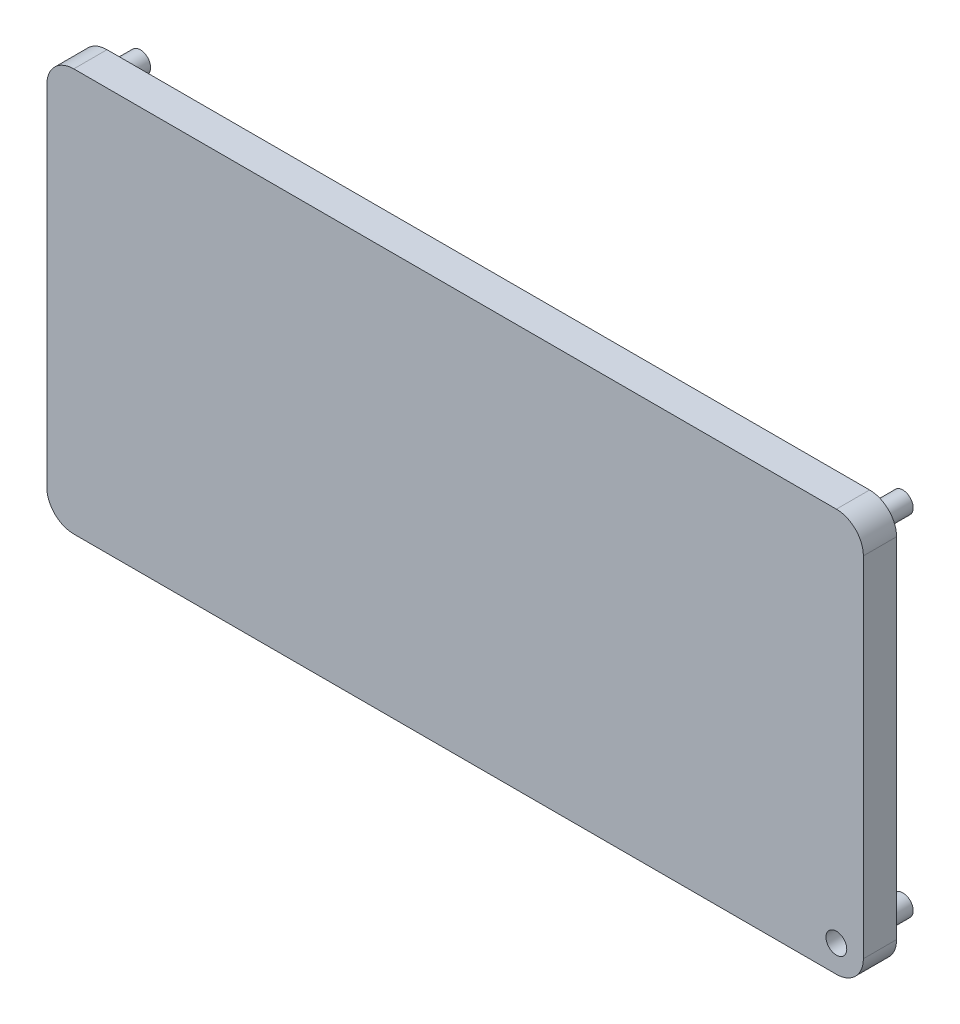
ISO-10303-21;
HEADER;
FILE_DESCRIPTION(('STEP AP214'),'2;1');
FILE_NAME('part.step','',(''),(''),'','','');
FILE_SCHEMA(('AUTOMOTIVE_DESIGN { 1 0 10303 214 1 1 1 1 }'));
ENDSEC;
DATA;
#1=APPLICATION_CONTEXT('core data for automotive mechanical design processes');
#2=APPLICATION_PROTOCOL_DEFINITION('international standard','automotive_design',2000,#1);
#3=PRODUCT_CONTEXT('',#1,'mechanical');
#4=PRODUCT('Part','Part','',(#3));
#5=PRODUCT_RELATED_PRODUCT_CATEGORY('part','',(#4));
#6=PRODUCT_DEFINITION_FORMATION('','',#4);
#7=PRODUCT_DEFINITION_CONTEXT('part definition',#1,'design');
#8=PRODUCT_DEFINITION('design','',#6,#7);
#9=PRODUCT_DEFINITION_SHAPE('','',#8);
#10=(LENGTH_UNIT() NAMED_UNIT(*) SI_UNIT(.MILLI.,.METRE.));
#11=(NAMED_UNIT(*) PLANE_ANGLE_UNIT() SI_UNIT($,.RADIAN.));
#12=(NAMED_UNIT(*) SI_UNIT($,.STERADIAN.) SOLID_ANGLE_UNIT());
#13=UNCERTAINTY_MEASURE_WITH_UNIT(LENGTH_MEASURE(1.E-05),#10,'distance_accuracy_value','');
#14=(GEOMETRIC_REPRESENTATION_CONTEXT(3) GLOBAL_UNCERTAINTY_ASSIGNED_CONTEXT((#13)) GLOBAL_UNIT_ASSIGNED_CONTEXT((#10,
#11,#12)) REPRESENTATION_CONTEXT('',''));
#15=CARTESIAN_POINT('',(0.,0.,0.));
#16=DIRECTION('',(0.,0.,1.));
#17=DIRECTION('',(1.,0.,0.));
#18=AXIS2_PLACEMENT_3D('',#15,#16,#17);
#19=CARTESIAN_POINT('',(58.297572,-26.67,5.08));
#20=DIRECTION('',(0.,0.,-1.));
#21=DIRECTION('',(-1.,0.,0.));
#22=AXIS2_PLACEMENT_3D('',#19,#20,#21);
#23=CYLINDRICAL_SURFACE('',#22,1.5875);
#24=CARTESIAN_POINT('',(58.297572,-26.67,5.08));
#25=DIRECTION('',(0.,0.,1.));
#26=DIRECTION('',(1.,0.,0.));
#27=AXIS2_PLACEMENT_3D('',#24,#25,#26);
#28=CIRCLE('',#27,1.5875);
#29=CARTESIAN_POINT('',(59.885072,-26.67,5.08));
#30=VERTEX_POINT('',#29);
#31=EDGE_CURVE('E12',#30,#30,#28,.T.);
#32=ORIENTED_EDGE('',*,*,#31,.F.);
#33=EDGE_LOOP('',(#32));
#34=FACE_BOUND('',#33,.T.);
#35=CARTESIAN_POINT('',(58.297572,-26.67,0.));
#36=DIRECTION('',(0.,0.,1.));
#37=DIRECTION('',(1.,0.,0.));
#38=AXIS2_PLACEMENT_3D('',#35,#36,#37);
#39=CIRCLE('',#38,1.5875);
#40=CARTESIAN_POINT('',(59.885072,-26.67,0.));
#41=VERTEX_POINT('',#40);
#42=EDGE_CURVE('E127',#41,#41,#39,.T.);
#43=ORIENTED_EDGE('',*,*,#42,.T.);
#44=EDGE_LOOP('',(#43));
#45=FACE_BOUND('',#44,.T.);
#46=ADVANCED_FACE('F124',(#34,#45),#23,.T.);
#47=CARTESIAN_POINT('',(0.,0.,5.08));
#48=DIRECTION('',(0.,0.,1.));
#49=DIRECTION('',(1.,0.,0.));
#50=AXIS2_PLACEMENT_3D('',#47,#48,#49);
#51=PLANE('',#50);
#52=ORIENTED_EDGE('',*,*,#31,.T.);
#53=EDGE_LOOP('',(#52));
#54=FACE_BOUND('',#53,.T.);
#55=ADVANCED_FACE('F139',(#54),#51,.T.);
#56=CARTESIAN_POINT('',(0.,0.,0.));
#57=DIRECTION('',(0.,0.,1.));
#58=DIRECTION('',(1.,0.,0.));
#59=AXIS2_PLACEMENT_3D('',#56,#57,#58);
#60=PLANE('',#59);
#61=ORIENTED_EDGE('',*,*,#42,.F.);
#62=EDGE_LOOP('',(#61));
#63=FACE_BOUND('',#62,.T.);
#64=ADVANCED_FACE('F137',(#63),#60,.F.);
#65=CLOSED_SHELL('',(#46,#55,#64));
#66=MANIFOLD_SOLID_BREP('B2',#65);
#67=CARTESIAN_POINT('',(-58.297572,-26.67,5.08));
#68=DIRECTION('',(0.,0.,-1.));
#69=DIRECTION('',(-1.,0.,0.));
#70=AXIS2_PLACEMENT_3D('',#67,#68,#69);
#71=CYLINDRICAL_SURFACE('',#70,1.5875);
#72=CARTESIAN_POINT('',(-58.297572,-26.67,5.08));
#73=DIRECTION('',(0.,0.,1.));
#74=DIRECTION('',(1.,0.,0.));
#75=AXIS2_PLACEMENT_3D('',#72,#73,#74);
#76=CIRCLE('',#75,1.5875);
#77=CARTESIAN_POINT('',(-56.710072,-26.67,5.08));
#78=VERTEX_POINT('',#77);
#79=EDGE_CURVE('E300',#78,#78,#76,.T.);
#80=ORIENTED_EDGE('',*,*,#79,.F.);
#81=EDGE_LOOP('',(#80));
#82=FACE_BOUND('',#81,.T.);
#83=CARTESIAN_POINT('',(-58.297572,-26.67,0.));
#84=DIRECTION('',(0.,0.,1.));
#85=DIRECTION('',(1.,0.,0.));
#86=AXIS2_PLACEMENT_3D('',#83,#84,#85);
#87=CIRCLE('',#86,1.5875);
#88=CARTESIAN_POINT('',(-56.710072,-26.67,0.));
#89=VERTEX_POINT('',#88);
#90=EDGE_CURVE('E299',#89,#89,#87,.T.);
#91=ORIENTED_EDGE('',*,*,#90,.T.);
#92=EDGE_LOOP('',(#91));
#93=FACE_BOUND('',#92,.T.);
#94=ADVANCED_FACE('F165',(#82,#93),#71,.T.);
#95=CARTESIAN_POINT('',(0.,0.,0.));
#96=DIRECTION('',(0.,0.,1.));
#97=DIRECTION('',(1.,0.,0.));
#98=AXIS2_PLACEMENT_3D('',#95,#96,#97);
#99=PLANE('',#98);
#100=ORIENTED_EDGE('',*,*,#90,.F.);
#101=EDGE_LOOP('',(#100));
#102=FACE_BOUND('',#101,.T.);
#103=ADVANCED_FACE('F325',(#102),#99,.F.);
#104=CARTESIAN_POINT('',(58.297572,-26.67,10.16));
#105=DIRECTION('',(0.,0.,-1.));
#106=DIRECTION('',(-1.,0.,0.));
#107=AXIS2_PLACEMENT_3D('',#104,#105,#106);
#108=CYLINDRICAL_SURFACE('',#107,1.5875);
#109=CARTESIAN_POINT('',(58.297572,-26.67,10.16));
#110=DIRECTION('',(0.,0.,1.));
#111=DIRECTION('',(1.,0.,0.));
#112=AXIS2_PLACEMENT_3D('',#109,#110,#111);
#113=CIRCLE('',#112,1.5875);
#114=CARTESIAN_POINT('',(59.885072,-26.67,10.16));
#115=VERTEX_POINT('',#114);
#116=EDGE_CURVE('E258',#115,#115,#113,.T.);
#117=ORIENTED_EDGE('',*,*,#116,.T.);
#118=EDGE_LOOP('',(#117));
#119=FACE_BOUND('',#118,.T.);
#120=CARTESIAN_POINT('',(58.297572,-26.67,5.08));
#121=DIRECTION('',(0.,0.,1.));
#122=DIRECTION('',(1.,0.,0.));
#123=AXIS2_PLACEMENT_3D('',#120,#121,#122);
#124=CIRCLE('',#123,1.5875);
#125=CARTESIAN_POINT('',(59.885072,-26.67,5.08));
#126=VERTEX_POINT('',#125);
#127=EDGE_CURVE('E285',#126,#126,#124,.T.);
#128=ORIENTED_EDGE('',*,*,#127,.F.);
#129=EDGE_LOOP('',(#128));
#130=FACE_BOUND('',#129,.T.);
#131=ADVANCED_FACE('F322',(#119,#130),#108,.F.);
#132=CARTESIAN_POINT('',(58.297572,-26.67,10.16));
#133=DIRECTION('',(0.,0.,-1.));
#134=DIRECTION('',(-1.,0.,0.));
#135=AXIS2_PLACEMENT_3D('',#132,#133,#134);
#136=CYLINDRICAL_SURFACE('',#135,4.1275);
#137=CARTESIAN_POINT('',(58.297572,-26.67,5.08));
#138=DIRECTION('',(0.,0.,1.));
#139=DIRECTION('',(1.,0.,0.));
#140=AXIS2_PLACEMENT_3D('',#137,#138,#139);
#141=CIRCLE('',#140,4.1275);
#142=CARTESIAN_POINT('',(58.297572,-30.7975,5.08));
#143=VERTEX_POINT('',#142);
#144=CARTESIAN_POINT('',(62.425072,-26.67,5.08));
#145=VERTEX_POINT('',#144);
#146=EDGE_CURVE('E267',#143,#145,#141,.T.);
#147=ORIENTED_EDGE('',*,*,#146,.T.);
#148=DIRECTION('',(0.,0.,-1.));
#149=VECTOR('',#148,1.);
#150=CARTESIAN_POINT('',(62.425072,-26.67,10.16));
#151=LINE('',#150,#149);
#152=CARTESIAN_POINT('',(62.425072,-26.67,10.16));
#153=VERTEX_POINT('',#152);
#154=EDGE_CURVE('E296',#153,#145,#151,.T.);
#155=ORIENTED_EDGE('',*,*,#154,.F.);
#156=CARTESIAN_POINT('',(58.297572,-26.67,10.16));
#157=DIRECTION('',(0.,0.,1.));
#158=DIRECTION('',(1.,0.,0.));
#159=AXIS2_PLACEMENT_3D('',#156,#157,#158);
#160=CIRCLE('',#159,4.1275);
#161=CARTESIAN_POINT('',(58.297572,-30.7975,10.16));
#162=VERTEX_POINT('',#161);
#163=EDGE_CURVE('E487',#162,#153,#160,.T.);
#164=ORIENTED_EDGE('',*,*,#163,.F.);
#165=DIRECTION('',(0.,0.,-1.));
#166=VECTOR('',#165,1.);
#167=CARTESIAN_POINT('',(58.297572,-30.7975,10.16));
#168=LINE('',#167,#166);
#169=EDGE_CURVE('E220',#162,#143,#168,.T.);
#170=ORIENTED_EDGE('',*,*,#169,.T.);
#171=EDGE_LOOP('',(#147,#155,#164,#170));
#172=FACE_BOUND('',#171,.T.);
#173=ADVANCED_FACE('F324',(#172),#136,.T.);
#174=CARTESIAN_POINT('',(62.425072,0.,10.16));
#175=DIRECTION('',(1.,0.,0.));
#176=DIRECTION('',(0.,0.,-1.));
#177=AXIS2_PLACEMENT_3D('',#174,#175,#176);
#178=PLANE('',#177);
#179=DIRECTION('',(0.,-1.,0.));
#180=VECTOR('',#179,1.);
#181=CARTESIAN_POINT('',(62.425072,0.,5.08));
#182=LINE('',#181,#180);
#183=CARTESIAN_POINT('',(62.425072,26.67,5.08));
#184=VERTEX_POINT('',#183);
#185=EDGE_CURVE('E271',#184,#145,#182,.T.);
#186=ORIENTED_EDGE('',*,*,#185,.F.);
#187=DIRECTION('',(0.,0.,-1.));
#188=VECTOR('',#187,1.);
#189=CARTESIAN_POINT('',(62.425072,26.67,10.16));
#190=LINE('',#189,#188);
#191=CARTESIAN_POINT('',(62.425072,26.67,10.16));
#192=VERTEX_POINT('',#191);
#193=EDGE_CURVE('E294',#192,#184,#190,.T.);
#194=ORIENTED_EDGE('',*,*,#193,.F.);
#195=DIRECTION('',(0.,-1.,0.));
#196=VECTOR('',#195,1.);
#197=CARTESIAN_POINT('',(62.425072,0.,10.16));
#198=LINE('',#197,#196);
#199=EDGE_CURVE('E489',#192,#153,#198,.T.);
#200=ORIENTED_EDGE('',*,*,#199,.T.);
#201=ORIENTED_EDGE('',*,*,#154,.T.);
#202=EDGE_LOOP('',(#186,#194,#200,#201));
#203=FACE_BOUND('',#202,.T.);
#204=ADVANCED_FACE('F332',(#203),#178,.T.);
#205=CARTESIAN_POINT('',(58.297572,26.67,10.16));
#206=DIRECTION('',(0.,0.,-1.));
#207=DIRECTION('',(-1.,0.,0.));
#208=AXIS2_PLACEMENT_3D('',#205,#206,#207);
#209=CYLINDRICAL_SURFACE('',#208,4.1275);
#210=CARTESIAN_POINT('',(58.297572,26.67,5.08));
#211=DIRECTION('',(0.,0.,1.));
#212=DIRECTION('',(1.,0.,0.));
#213=AXIS2_PLACEMENT_3D('',#210,#211,#212);
#214=CIRCLE('',#213,4.1275);
#215=CARTESIAN_POINT('',(58.297572,30.7975,5.08));
#216=VERTEX_POINT('',#215);
#217=EDGE_CURVE('E274',#184,#216,#214,.T.);
#218=ORIENTED_EDGE('',*,*,#217,.T.);
#219=DIRECTION('',(0.,0.,-1.));
#220=VECTOR('',#219,1.);
#221=CARTESIAN_POINT('',(58.297572,30.7975,10.16));
#222=LINE('',#221,#220);
#223=CARTESIAN_POINT('',(58.297572,30.7975,10.16));
#224=VERTEX_POINT('',#223);
#225=EDGE_CURVE('E292',#224,#216,#222,.T.);
#226=ORIENTED_EDGE('',*,*,#225,.F.);
#227=CARTESIAN_POINT('',(58.297572,26.67,10.16));
#228=DIRECTION('',(0.,0.,1.));
#229=DIRECTION('',(1.,0.,0.));
#230=AXIS2_PLACEMENT_3D('',#227,#228,#229);
#231=CIRCLE('',#230,4.1275);
#232=EDGE_CURVE('E492',#192,#224,#231,.T.);
#233=ORIENTED_EDGE('',*,*,#232,.F.);
#234=ORIENTED_EDGE('',*,*,#193,.T.);
#235=EDGE_LOOP('',(#218,#226,#233,#234));
#236=FACE_BOUND('',#235,.T.);
#237=ADVANCED_FACE('F368',(#236),#209,.T.);
#238=CARTESIAN_POINT('',(0.,30.7975,10.16));
#239=DIRECTION('',(0.,1.,0.));
#240=DIRECTION('',(0.,0.,1.));
#241=AXIS2_PLACEMENT_3D('',#238,#239,#240);
#242=PLANE('',#241);
#243=DIRECTION('',(1.,0.,0.));
#244=VECTOR('',#243,1.);
#245=CARTESIAN_POINT('',(0.,30.7975,5.08));
#246=LINE('',#245,#244);
#247=CARTESIAN_POINT('',(-58.297572,30.7975,5.08));
#248=VERTEX_POINT('',#247);
#249=EDGE_CURVE('E277',#248,#216,#246,.T.);
#250=ORIENTED_EDGE('',*,*,#249,.F.);
#251=DIRECTION('',(0.,0.,-1.));
#252=VECTOR('',#251,1.);
#253=CARTESIAN_POINT('',(-58.297572,30.7975,10.16));
#254=LINE('',#253,#252);
#255=CARTESIAN_POINT('',(-58.297572,30.7975,10.16));
#256=VERTEX_POINT('',#255);
#257=EDGE_CURVE('E254',#256,#248,#254,.T.);
#258=ORIENTED_EDGE('',*,*,#257,.F.);
#259=DIRECTION('',(1.,0.,0.));
#260=VECTOR('',#259,1.);
#261=CARTESIAN_POINT('',(0.,30.7975,10.16));
#262=LINE('',#261,#260);
#263=EDGE_CURVE('E243',#256,#224,#262,.T.);
#264=ORIENTED_EDGE('',*,*,#263,.T.);
#265=ORIENTED_EDGE('',*,*,#225,.T.);
#266=EDGE_LOOP('',(#250,#258,#264,#265));
#267=FACE_BOUND('',#266,.T.);
#268=ADVANCED_FACE('F378',(#267),#242,.T.);
#269=CARTESIAN_POINT('',(-58.297572,26.67,10.16));
#270=DIRECTION('',(0.,0.,-1.));
#271=DIRECTION('',(-1.,0.,0.));
#272=AXIS2_PLACEMENT_3D('',#269,#270,#271);
#273=CYLINDRICAL_SURFACE('',#272,4.1275);
#274=CARTESIAN_POINT('',(-58.297572,26.67,5.08));
#275=DIRECTION('',(0.,0.,1.));
#276=DIRECTION('',(1.,0.,0.));
#277=AXIS2_PLACEMENT_3D('',#274,#275,#276);
#278=CIRCLE('',#277,4.1275);
#279=CARTESIAN_POINT('',(-62.425072,26.67,5.08));
#280=VERTEX_POINT('',#279);
#281=EDGE_CURVE('E250',#248,#280,#278,.T.);
#282=ORIENTED_EDGE('',*,*,#281,.T.);
#283=DIRECTION('',(0.,0.,-1.));
#284=VECTOR('',#283,1.);
#285=CARTESIAN_POINT('',(-62.425072,26.67,10.16));
#286=LINE('',#285,#284);
#287=CARTESIAN_POINT('',(-62.425072,26.67,10.16));
#288=VERTEX_POINT('',#287);
#289=EDGE_CURVE('E247',#288,#280,#286,.T.);
#290=ORIENTED_EDGE('',*,*,#289,.F.);
#291=CARTESIAN_POINT('',(-58.297572,26.67,10.16));
#292=DIRECTION('',(0.,0.,1.));
#293=DIRECTION('',(1.,0.,0.));
#294=AXIS2_PLACEMENT_3D('',#291,#292,#293);
#295=CIRCLE('',#294,4.1275);
#296=EDGE_CURVE('E236',#256,#288,#295,.T.);
#297=ORIENTED_EDGE('',*,*,#296,.F.);
#298=ORIENTED_EDGE('',*,*,#257,.T.);
#299=EDGE_LOOP('',(#282,#290,#297,#298));
#300=FACE_BOUND('',#299,.T.);
#301=ADVANCED_FACE('F248',(#300),#273,.T.);
#302=CARTESIAN_POINT('',(-62.425072,0.,10.16));
#303=DIRECTION('',(-1.,0.,0.));
#304=DIRECTION('',(0.,0.,1.));
#305=AXIS2_PLACEMENT_3D('',#302,#303,#304);
#306=PLANE('',#305);
#307=DIRECTION('',(0.,1.,0.));
#308=VECTOR('',#307,1.);
#309=CARTESIAN_POINT('',(-62.425072,0.,5.08));
#310=LINE('',#309,#308);
#311=CARTESIAN_POINT('',(-62.425072,-26.67,5.08));
#312=VERTEX_POINT('',#311);
#313=EDGE_CURVE('E281',#312,#280,#310,.T.);
#314=ORIENTED_EDGE('',*,*,#313,.F.);
#315=DIRECTION('',(0.,0.,-1.));
#316=VECTOR('',#315,1.);
#317=CARTESIAN_POINT('',(-62.425072,-26.67,10.16));
#318=LINE('',#317,#316);
#319=CARTESIAN_POINT('',(-62.425072,-26.67,10.16));
#320=VERTEX_POINT('',#319);
#321=EDGE_CURVE('E209',#320,#312,#318,.T.);
#322=ORIENTED_EDGE('',*,*,#321,.F.);
#323=DIRECTION('',(0.,1.,0.));
#324=VECTOR('',#323,1.);
#325=CARTESIAN_POINT('',(-62.425072,0.,10.16));
#326=LINE('',#325,#324);
#327=EDGE_CURVE('E241',#320,#288,#326,.T.);
#328=ORIENTED_EDGE('',*,*,#327,.T.);
#329=ORIENTED_EDGE('',*,*,#289,.T.);
#330=EDGE_LOOP('',(#314,#322,#328,#329));
#331=FACE_BOUND('',#330,.T.);
#332=ADVANCED_FACE('F256',(#331),#306,.T.);
#333=CARTESIAN_POINT('',(-58.297572,-26.67,10.16));
#334=DIRECTION('',(0.,0.,-1.));
#335=DIRECTION('',(-1.,0.,0.));
#336=AXIS2_PLACEMENT_3D('',#333,#334,#335);
#337=CYLINDRICAL_SURFACE('',#336,4.1275);
#338=CARTESIAN_POINT('',(-58.297572,-26.67,5.08));
#339=DIRECTION('',(0.,0.,1.));
#340=DIRECTION('',(1.,0.,0.));
#341=AXIS2_PLACEMENT_3D('',#338,#339,#340);
#342=CIRCLE('',#341,4.1275);
#343=CARTESIAN_POINT('',(-58.297572,-30.7975,5.08));
#344=VERTEX_POINT('',#343);
#345=EDGE_CURVE('E283',#312,#344,#342,.T.);
#346=ORIENTED_EDGE('',*,*,#345,.T.);
#347=DIRECTION('',(0.,0.,-1.));
#348=VECTOR('',#347,1.);
#349=CARTESIAN_POINT('',(-58.297572,-30.7975,10.16));
#350=LINE('',#349,#348);
#351=CARTESIAN_POINT('',(-58.297572,-30.7975,10.16));
#352=VERTEX_POINT('',#351);
#353=EDGE_CURVE('E216',#352,#344,#350,.T.);
#354=ORIENTED_EDGE('',*,*,#353,.F.);
#355=CARTESIAN_POINT('',(-58.297572,-26.67,10.16));
#356=DIRECTION('',(0.,0.,1.));
#357=DIRECTION('',(1.,0.,0.));
#358=AXIS2_PLACEMENT_3D('',#355,#356,#357);
#359=CIRCLE('',#358,4.1275);
#360=EDGE_CURVE('E181',#320,#352,#359,.T.);
#361=ORIENTED_EDGE('',*,*,#360,.F.);
#362=ORIENTED_EDGE('',*,*,#321,.T.);
#363=EDGE_LOOP('',(#346,#354,#361,#362));
#364=FACE_BOUND('',#363,.T.);
#365=ADVANCED_FACE('F405',(#364),#337,.T.);
#366=CARTESIAN_POINT('',(0.,-30.7975,10.16));
#367=DIRECTION('',(0.,-1.,0.));
#368=DIRECTION('',(0.,0.,-1.));
#369=AXIS2_PLACEMENT_3D('',#366,#367,#368);
#370=PLANE('',#369);
#371=DIRECTION('',(-1.,0.,0.));
#372=VECTOR('',#371,1.);
#373=CARTESIAN_POINT('',(0.,-30.7975,5.08));
#374=LINE('',#373,#372);
#375=EDGE_CURVE('E264',#143,#344,#374,.T.);
#376=ORIENTED_EDGE('',*,*,#375,.F.);
#377=ORIENTED_EDGE('',*,*,#169,.F.);
#378=DIRECTION('',(-1.,0.,0.));
#379=VECTOR('',#378,1.);
#380=CARTESIAN_POINT('',(0.,-30.7975,10.16));
#381=LINE('',#380,#379);
#382=EDGE_CURVE('E288',#162,#352,#381,.T.);
#383=ORIENTED_EDGE('',*,*,#382,.T.);
#384=ORIENTED_EDGE('',*,*,#353,.T.);
#385=EDGE_LOOP('',(#376,#377,#383,#384));
#386=FACE_BOUND('',#385,.T.);
#387=ADVANCED_FACE('F313',(#386),#370,.T.);
#388=CARTESIAN_POINT('',(0.,0.,5.08));
#389=DIRECTION('',(0.,0.,1.));
#390=DIRECTION('',(1.,0.,0.));
#391=AXIS2_PLACEMENT_3D('',#388,#389,#390);
#392=PLANE('',#391);
#393=CARTESIAN_POINT('',(58.297572,26.67,5.08));
#394=DIRECTION('',(0.,0.,1.));
#395=DIRECTION('',(1.,0.,0.));
#396=AXIS2_PLACEMENT_3D('',#393,#394,#395);
#397=CIRCLE('',#396,1.5875);
#398=CARTESIAN_POINT('',(59.885072,26.67,5.08));
#399=VERTEX_POINT('',#398);
#400=EDGE_CURVE('E122',#399,#399,#397,.F.);
#401=ORIENTED_EDGE('',*,*,#400,.F.);
#402=EDGE_LOOP('',(#401));
#403=FACE_BOUND('',#402,.T.);
#404=CARTESIAN_POINT('',(-58.297572,26.67,5.08));
#405=DIRECTION('',(0.,0.,1.));
#406=DIRECTION('',(1.,0.,0.));
#407=AXIS2_PLACEMENT_3D('',#404,#405,#406);
#408=CIRCLE('',#407,1.5875);
#409=CARTESIAN_POINT('',(-56.710072,26.67,5.08));
#410=VERTEX_POINT('',#409);
#411=EDGE_CURVE('E173',#410,#410,#408,.F.);
#412=ORIENTED_EDGE('',*,*,#411,.F.);
#413=EDGE_LOOP('',(#412));
#414=FACE_BOUND('',#413,.T.);
#415=ORIENTED_EDGE('',*,*,#79,.T.);
#416=EDGE_LOOP('',(#415));
#417=FACE_BOUND('',#416,.T.);
#418=ORIENTED_EDGE('',*,*,#375,.T.);
#419=ORIENTED_EDGE('',*,*,#345,.F.);
#420=ORIENTED_EDGE('',*,*,#313,.T.);
#421=ORIENTED_EDGE('',*,*,#281,.F.);
#422=ORIENTED_EDGE('',*,*,#249,.T.);
#423=ORIENTED_EDGE('',*,*,#217,.F.);
#424=ORIENTED_EDGE('',*,*,#185,.T.);
#425=ORIENTED_EDGE('',*,*,#146,.F.);
#426=EDGE_LOOP('',(#418,#419,#420,#421,#422,#423,#424,#425));
#427=FACE_BOUND('',#426,.T.);
#428=ORIENTED_EDGE('',*,*,#127,.T.);
#429=EDGE_LOOP('',(#428));
#430=FACE_BOUND('',#429,.T.);
#431=ADVANCED_FACE('F310',(#403,#414,#417,#427,#430),#392,.F.);
#432=CARTESIAN_POINT('',(0.,0.,10.16));
#433=DIRECTION('',(0.,0.,1.));
#434=DIRECTION('',(1.,0.,0.));
#435=AXIS2_PLACEMENT_3D('',#432,#433,#434);
#436=PLANE('',#435);
#437=ORIENTED_EDGE('',*,*,#382,.F.);
#438=ORIENTED_EDGE('',*,*,#163,.T.);
#439=ORIENTED_EDGE('',*,*,#199,.F.);
#440=ORIENTED_EDGE('',*,*,#232,.T.);
#441=ORIENTED_EDGE('',*,*,#263,.F.);
#442=ORIENTED_EDGE('',*,*,#296,.T.);
#443=ORIENTED_EDGE('',*,*,#327,.F.);
#444=ORIENTED_EDGE('',*,*,#360,.T.);
#445=EDGE_LOOP('',(#437,#438,#439,#440,#441,#442,#443,#444));
#446=FACE_BOUND('',#445,.T.);
#447=ORIENTED_EDGE('',*,*,#116,.F.);
#448=EDGE_LOOP('',(#447));
#449=FACE_BOUND('',#448,.T.);
#450=ADVANCED_FACE('F238',(#446,#449),#436,.T.);
#451=CARTESIAN_POINT('',(-58.297572,26.67,5.08));
#452=DIRECTION('',(0.,0.,-1.));
#453=DIRECTION('',(-1.,0.,0.));
#454=AXIS2_PLACEMENT_3D('',#451,#452,#453);
#455=CYLINDRICAL_SURFACE('',#454,1.5875);
#456=ORIENTED_EDGE('',*,*,#411,.T.);
#457=EDGE_LOOP('',(#456));
#458=FACE_BOUND('',#457,.T.);
#459=CARTESIAN_POINT('',(-58.297572,26.67,0.));
#460=DIRECTION('',(0.,0.,1.));
#461=DIRECTION('',(1.,0.,0.));
#462=AXIS2_PLACEMENT_3D('',#459,#460,#461);
#463=CIRCLE('',#462,1.5875);
#464=CARTESIAN_POINT('',(-56.710072,26.67,0.));
#465=VERTEX_POINT('',#464);
#466=EDGE_CURVE('E268',#465,#465,#463,.T.);
#467=ORIENTED_EDGE('',*,*,#466,.T.);
#468=EDGE_LOOP('',(#467));
#469=FACE_BOUND('',#468,.T.);
#470=ADVANCED_FACE('F307',(#458,#469),#455,.T.);
#471=CARTESIAN_POINT('',(0.,0.,0.));
#472=DIRECTION('',(0.,0.,1.));
#473=DIRECTION('',(1.,0.,0.));
#474=AXIS2_PLACEMENT_3D('',#471,#472,#473);
#475=PLANE('',#474);
#476=ORIENTED_EDGE('',*,*,#466,.F.);
#477=EDGE_LOOP('',(#476));
#478=FACE_BOUND('',#477,.T.);
#479=ADVANCED_FACE('F446',(#478),#475,.F.);
#480=CARTESIAN_POINT('',(58.297572,26.67,5.08));
#481=DIRECTION('',(0.,0.,-1.));
#482=DIRECTION('',(-1.,0.,0.));
#483=AXIS2_PLACEMENT_3D('',#480,#481,#482);
#484=CYLINDRICAL_SURFACE('',#483,1.5875);
#485=ORIENTED_EDGE('',*,*,#400,.T.);
#486=EDGE_LOOP('',(#485));
#487=FACE_BOUND('',#486,.T.);
#488=CARTESIAN_POINT('',(58.297572,26.67,0.));
#489=DIRECTION('',(0.,0.,1.));
#490=DIRECTION('',(1.,0.,0.));
#491=AXIS2_PLACEMENT_3D('',#488,#489,#490);
#492=CIRCLE('',#491,1.5875);
#493=CARTESIAN_POINT('',(59.885072,26.67,0.));
#494=VERTEX_POINT('',#493);
#495=EDGE_CURVE('E480',#494,#494,#492,.T.);
#496=ORIENTED_EDGE('',*,*,#495,.T.);
#497=EDGE_LOOP('',(#496));
#498=FACE_BOUND('',#497,.T.);
#499=ADVANCED_FACE('F455',(#487,#498),#484,.T.);
#500=CARTESIAN_POINT('',(0.,0.,0.));
#501=DIRECTION('',(0.,0.,1.));
#502=DIRECTION('',(1.,0.,0.));
#503=AXIS2_PLACEMENT_3D('',#500,#501,#502);
#504=PLANE('',#503);
#505=ORIENTED_EDGE('',*,*,#495,.F.);
#506=EDGE_LOOP('',(#505));
#507=FACE_BOUND('',#506,.T.);
#508=ADVANCED_FACE('F465',(#507),#504,.F.);
#509=CLOSED_SHELL('',(#94,#103,#131,#173,#204,#237,#268,#301,#332,#365,#387,#431,#450,#470,#479,
#499,#508));
#510=MANIFOLD_SOLID_BREP('B7',#509);
#511=ADVANCED_BREP_SHAPE_REPRESENTATION('',(#18,#66,#510),#14);
#512=SHAPE_DEFINITION_REPRESENTATION(#9,#511);
ENDSEC;
END-ISO-10303-21;
